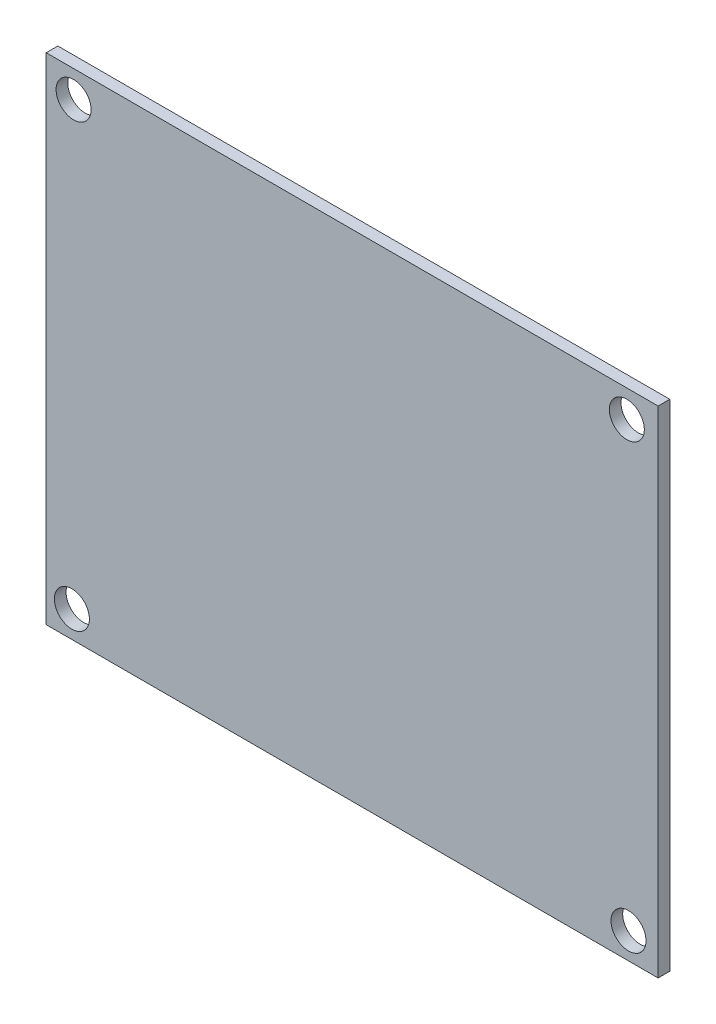
ISO-10303-21;
HEADER;
FILE_DESCRIPTION(('STEP AP214'),'2;1');
FILE_NAME('part.step','',(''),(''),'','','');
FILE_SCHEMA(('AUTOMOTIVE_DESIGN { 1 0 10303 214 1 1 1 1 }'));
ENDSEC;
DATA;
#1=APPLICATION_CONTEXT('core data for automotive mechanical design processes');
#2=APPLICATION_PROTOCOL_DEFINITION('international standard','automotive_design',2000,#1);
#3=PRODUCT_CONTEXT('',#1,'mechanical');
#4=PRODUCT('Part','Part','',(#3));
#5=PRODUCT_RELATED_PRODUCT_CATEGORY('part','',(#4));
#6=PRODUCT_DEFINITION_FORMATION('','',#4);
#7=PRODUCT_DEFINITION_CONTEXT('part definition',#1,'design');
#8=PRODUCT_DEFINITION('design','',#6,#7);
#9=PRODUCT_DEFINITION_SHAPE('','',#8);
#10=(LENGTH_UNIT() NAMED_UNIT(*) SI_UNIT(.MILLI.,.METRE.));
#11=(NAMED_UNIT(*) PLANE_ANGLE_UNIT() SI_UNIT($,.RADIAN.));
#12=(NAMED_UNIT(*) SI_UNIT($,.STERADIAN.) SOLID_ANGLE_UNIT());
#13=UNCERTAINTY_MEASURE_WITH_UNIT(LENGTH_MEASURE(1.E-05),#10,'distance_accuracy_value','');
#14=(GEOMETRIC_REPRESENTATION_CONTEXT(3) GLOBAL_UNCERTAINTY_ASSIGNED_CONTEXT((#13)) GLOBAL_UNIT_ASSIGNED_CONTEXT((#10,
#11,#12)) REPRESENTATION_CONTEXT('',''));
#15=CARTESIAN_POINT('',(0.,0.,0.));
#16=DIRECTION('',(0.,0.,1.));
#17=DIRECTION('',(1.,0.,0.));
#18=AXIS2_PLACEMENT_3D('',#15,#16,#17);
#19=CARTESIAN_POINT('',(0.,0.,2.));
#20=DIRECTION('',(0.,0.,1.));
#21=DIRECTION('',(1.,0.,0.));
#22=AXIS2_PLACEMENT_3D('',#19,#20,#21);
#23=PLANE('',#22);
#24=CARTESIAN_POINT('',(51.6959064904671,-46.9145005593792,2.));
#25=DIRECTION('',(0.,0.,1.));
#26=DIRECTION('',(1.,0.,0.));
#27=AXIS2_PLACEMENT_3D('',#24,#25,#26);
#28=CIRCLE('',#27,3.0033819293144);
#29=CARTESIAN_POINT('',(54.6992884197815,-46.9145005593792,2.));
#30=VERTEX_POINT('',#29);
#31=EDGE_CURVE('E125',#30,#30,#28,.T.);
#32=ORIENTED_EDGE('',*,*,#31,.F.);
#33=EDGE_LOOP('',(#32));
#34=FACE_BOUND('',#33,.T.);
#35=CARTESIAN_POINT('',(-43.525930299572,28.9850789753677,2.));
#36=DIRECTION('',(0.,0.,1.));
#37=DIRECTION('',(1.,0.,0.));
#38=AXIS2_PLACEMENT_3D('',#35,#36,#37);
#39=CIRCLE('',#38,3.0033819293144);
#40=CARTESIAN_POINT('',(-40.5225483702576,28.9850789753677,2.));
#41=VERTEX_POINT('',#40);
#42=EDGE_CURVE('E104',#41,#41,#39,.T.);
#43=ORIENTED_EDGE('',*,*,#42,.F.);
#44=EDGE_LOOP('',(#43));
#45=FACE_BOUND('',#44,.T.);
#46=DIRECTION('',(0.,-1.,0.));
#47=VECTOR('',#46,1.);
#48=CARTESIAN_POINT('',(-48.2234957020057,33.6103151862464,2.));
#49=LINE('',#48,#47);
#50=CARTESIAN_POINT('',(-48.2234957020057,33.6103151862464,2.));
#51=VERTEX_POINT('',#50);
#52=CARTESIAN_POINT('',(-48.2234957020057,-51.3896848137536,2.));
#53=VERTEX_POINT('',#52);
#54=EDGE_CURVE('E89',#51,#53,#49,.T.);
#55=ORIENTED_EDGE('',*,*,#54,.T.);
#56=DIRECTION('',(1.,0.,0.));
#57=VECTOR('',#56,1.);
#58=CARTESIAN_POINT('',(-48.2234957020057,-51.3896848137536,2.));
#59=LINE('',#58,#57);
#60=CARTESIAN_POINT('',(56.7765042979943,-51.3896848137536,2.));
#61=VERTEX_POINT('',#60);
#62=EDGE_CURVE('E84',#53,#61,#59,.T.);
#63=ORIENTED_EDGE('',*,*,#62,.T.);
#64=DIRECTION('',(0.,1.,0.));
#65=VECTOR('',#64,1.);
#66=CARTESIAN_POINT('',(56.7765042979943,33.6103151862464,2.));
#67=LINE('',#66,#65);
#68=CARTESIAN_POINT('',(56.7765042979943,33.6103151862464,2.));
#69=VERTEX_POINT('',#68);
#70=EDGE_CURVE('E87',#61,#69,#67,.T.);
#71=ORIENTED_EDGE('',*,*,#70,.T.);
#72=DIRECTION('',(-1.,0.,0.));
#73=VECTOR('',#72,1.);
#74=CARTESIAN_POINT('',(-48.2234957020057,33.6103151862464,2.));
#75=LINE('',#74,#73);
#76=EDGE_CURVE('E54',#69,#51,#75,.T.);
#77=ORIENTED_EDGE('',*,*,#76,.T.);
#78=EDGE_LOOP('',(#55,#63,#71,#77));
#79=FACE_BOUND('',#78,.T.);
#80=CARTESIAN_POINT('',(51.4072909805703,28.9296407296186,2.));
#81=DIRECTION('',(0.,0.,1.));
#82=DIRECTION('',(1.,0.,0.));
#83=AXIS2_PLACEMENT_3D('',#80,#81,#82);
#84=CIRCLE('',#83,3.0033819293144);
#85=CARTESIAN_POINT('',(54.4106729098847,28.9296407296186,2.));
#86=VERTEX_POINT('',#85);
#87=EDGE_CURVE('E119',#86,#86,#84,.T.);
#88=ORIENTED_EDGE('',*,*,#87,.F.);
#89=EDGE_LOOP('',(#88));
#90=FACE_BOUND('',#89,.T.);
#91=CARTESIAN_POINT('',(-43.8199031066054,-46.8494928662624,2.));
#92=DIRECTION('',(0.,0.,1.));
#93=DIRECTION('',(1.,0.,0.));
#94=AXIS2_PLACEMENT_3D('',#91,#92,#93);
#95=CIRCLE('',#94,3.0033819293144);
#96=CARTESIAN_POINT('',(-40.8165211772909,-46.8494928662624,2.));
#97=VERTEX_POINT('',#96);
#98=EDGE_CURVE('E131',#97,#97,#95,.T.);
#99=ORIENTED_EDGE('',*,*,#98,.F.);
#100=EDGE_LOOP('',(#99));
#101=FACE_BOUND('',#100,.T.);
#102=ADVANCED_FACE('F37',(#34,#45,#79,#90,#101),#23,.T.);
#103=CARTESIAN_POINT('',(0.,0.,0.));
#104=DIRECTION('',(0.,0.,1.));
#105=DIRECTION('',(1.,0.,0.));
#106=AXIS2_PLACEMENT_3D('',#103,#104,#105);
#107=PLANE('',#106);
#108=DIRECTION('',(0.,-1.,0.));
#109=VECTOR('',#108,1.);
#110=CARTESIAN_POINT('',(-48.2234957020057,33.6103151862464,0.));
#111=LINE('',#110,#109);
#112=CARTESIAN_POINT('',(-48.2234957020057,33.6103151862464,0.));
#113=VERTEX_POINT('',#112);
#114=CARTESIAN_POINT('',(-48.2234957020057,-51.3896848137536,0.));
#115=VERTEX_POINT('',#114);
#116=EDGE_CURVE('E101',#113,#115,#111,.T.);
#117=ORIENTED_EDGE('',*,*,#116,.F.);
#118=DIRECTION('',(-1.,0.,0.));
#119=VECTOR('',#118,1.);
#120=CARTESIAN_POINT('',(-48.2234957020057,33.6103151862464,0.));
#121=LINE('',#120,#119);
#122=CARTESIAN_POINT('',(56.7765042979943,33.6103151862464,0.));
#123=VERTEX_POINT('',#122);
#124=EDGE_CURVE('E77',#123,#113,#121,.T.);
#125=ORIENTED_EDGE('',*,*,#124,.F.);
#126=DIRECTION('',(0.,1.,0.));
#127=VECTOR('',#126,1.);
#128=CARTESIAN_POINT('',(56.7765042979943,33.6103151862464,0.));
#129=LINE('',#128,#127);
#130=CARTESIAN_POINT('',(56.7765042979943,-51.3896848137536,0.));
#131=VERTEX_POINT('',#130);
#132=EDGE_CURVE('E71',#131,#123,#129,.T.);
#133=ORIENTED_EDGE('',*,*,#132,.F.);
#134=DIRECTION('',(1.,0.,0.));
#135=VECTOR('',#134,1.);
#136=CARTESIAN_POINT('',(-48.2234957020057,-51.3896848137536,0.));
#137=LINE('',#136,#135);
#138=EDGE_CURVE('E93',#115,#131,#137,.T.);
#139=ORIENTED_EDGE('',*,*,#138,.F.);
#140=EDGE_LOOP('',(#117,#125,#133,#139));
#141=FACE_BOUND('',#140,.T.);
#142=CARTESIAN_POINT('',(-43.525930299572,28.9850789753677,0.));
#143=DIRECTION('',(0.,0.,1.));
#144=DIRECTION('',(1.,0.,0.));
#145=AXIS2_PLACEMENT_3D('',#142,#143,#144);
#146=CIRCLE('',#145,3.0033819293144);
#147=CARTESIAN_POINT('',(-40.5225483702576,28.9850789753677,0.));
#148=VERTEX_POINT('',#147);
#149=EDGE_CURVE('E116',#148,#148,#146,.T.);
#150=ORIENTED_EDGE('',*,*,#149,.T.);
#151=EDGE_LOOP('',(#150));
#152=FACE_BOUND('',#151,.T.);
#153=CARTESIAN_POINT('',(51.4072909805703,28.9296407296186,0.));
#154=DIRECTION('',(0.,0.,1.));
#155=DIRECTION('',(1.,0.,0.));
#156=AXIS2_PLACEMENT_3D('',#153,#154,#155);
#157=CIRCLE('',#156,3.0033819293144);
#158=CARTESIAN_POINT('',(54.4106729098847,28.9296407296186,0.));
#159=VERTEX_POINT('',#158);
#160=EDGE_CURVE('E122',#159,#159,#157,.T.);
#161=ORIENTED_EDGE('',*,*,#160,.T.);
#162=EDGE_LOOP('',(#161));
#163=FACE_BOUND('',#162,.T.);
#164=CARTESIAN_POINT('',(51.6959064904671,-46.9145005593792,0.));
#165=DIRECTION('',(0.,0.,1.));
#166=DIRECTION('',(1.,0.,0.));
#167=AXIS2_PLACEMENT_3D('',#164,#165,#166);
#168=CIRCLE('',#167,3.0033819293144);
#169=CARTESIAN_POINT('',(54.6992884197815,-46.9145005593792,0.));
#170=VERTEX_POINT('',#169);
#171=EDGE_CURVE('E128',#170,#170,#168,.T.);
#172=ORIENTED_EDGE('',*,*,#171,.T.);
#173=EDGE_LOOP('',(#172));
#174=FACE_BOUND('',#173,.T.);
#175=CARTESIAN_POINT('',(-43.8199031066054,-46.8494928662624,0.));
#176=DIRECTION('',(0.,0.,1.));
#177=DIRECTION('',(1.,0.,0.));
#178=AXIS2_PLACEMENT_3D('',#175,#176,#177);
#179=CIRCLE('',#178,3.0033819293144);
#180=CARTESIAN_POINT('',(-40.8165211772909,-46.8494928662624,0.));
#181=VERTEX_POINT('',#180);
#182=EDGE_CURVE('E134',#181,#181,#179,.T.);
#183=ORIENTED_EDGE('',*,*,#182,.T.);
#184=EDGE_LOOP('',(#183));
#185=FACE_BOUND('',#184,.T.);
#186=ADVANCED_FACE('F112',(#141,#152,#163,#174,#185),#107,.F.);
#187=CARTESIAN_POINT('',(-48.2234957020057,33.6103151862464,2.));
#188=DIRECTION('',(1.,0.,0.));
#189=DIRECTION('',(0.,0.,-1.));
#190=AXIS2_PLACEMENT_3D('',#187,#188,#189);
#191=PLANE('',#190);
#192=ORIENTED_EDGE('',*,*,#116,.T.);
#193=DIRECTION('',(0.,0.,-1.));
#194=VECTOR('',#193,1.);
#195=CARTESIAN_POINT('',(-48.2234957020057,-51.3896848137536,2.));
#196=LINE('',#195,#194);
#197=EDGE_CURVE('E11',#53,#115,#196,.T.);
#198=ORIENTED_EDGE('',*,*,#197,.F.);
#199=ORIENTED_EDGE('',*,*,#54,.F.);
#200=DIRECTION('',(0.,0.,-1.));
#201=VECTOR('',#200,1.);
#202=CARTESIAN_POINT('',(-48.2234957020057,33.6103151862464,2.));
#203=LINE('',#202,#201);
#204=EDGE_CURVE('E97',#51,#113,#203,.T.);
#205=ORIENTED_EDGE('',*,*,#204,.T.);
#206=EDGE_LOOP('',(#192,#198,#199,#205));
#207=FACE_BOUND('',#206,.T.);
#208=ADVANCED_FACE('F39',(#207),#191,.F.);
#209=CARTESIAN_POINT('',(-48.2234957020057,-51.3896848137536,2.));
#210=DIRECTION('',(0.,1.,0.));
#211=DIRECTION('',(-1.,0.,0.));
#212=AXIS2_PLACEMENT_3D('',#209,#210,#211);
#213=PLANE('',#212);
#214=ORIENTED_EDGE('',*,*,#138,.T.);
#215=DIRECTION('',(0.,0.,-1.));
#216=VECTOR('',#215,1.);
#217=CARTESIAN_POINT('',(56.7765042979943,-51.3896848137536,2.));
#218=LINE('',#217,#216);
#219=EDGE_CURVE('E46',#61,#131,#218,.T.);
#220=ORIENTED_EDGE('',*,*,#219,.F.);
#221=ORIENTED_EDGE('',*,*,#62,.F.);
#222=ORIENTED_EDGE('',*,*,#197,.T.);
#223=EDGE_LOOP('',(#214,#220,#221,#222));
#224=FACE_BOUND('',#223,.T.);
#225=ADVANCED_FACE('F92',(#224),#213,.F.);
#226=CARTESIAN_POINT('',(56.7765042979943,33.6103151862464,2.));
#227=DIRECTION('',(-1.,0.,0.));
#228=DIRECTION('',(0.,-1.,0.));
#229=AXIS2_PLACEMENT_3D('',#226,#227,#228);
#230=PLANE('',#229);
#231=ORIENTED_EDGE('',*,*,#132,.T.);
#232=DIRECTION('',(0.,0.,-1.));
#233=VECTOR('',#232,1.);
#234=CARTESIAN_POINT('',(56.7765042979943,33.6103151862464,2.));
#235=LINE('',#234,#233);
#236=EDGE_CURVE('E94',#69,#123,#235,.T.);
#237=ORIENTED_EDGE('',*,*,#236,.F.);
#238=ORIENTED_EDGE('',*,*,#70,.F.);
#239=ORIENTED_EDGE('',*,*,#219,.T.);
#240=EDGE_LOOP('',(#231,#237,#238,#239));
#241=FACE_BOUND('',#240,.T.);
#242=ADVANCED_FACE('F95',(#241),#230,.F.);
#243=CARTESIAN_POINT('',(-48.2234957020057,33.6103151862464,2.));
#244=DIRECTION('',(0.,-1.,0.));
#245=DIRECTION('',(0.,0.,-1.));
#246=AXIS2_PLACEMENT_3D('',#243,#244,#245);
#247=PLANE('',#246);
#248=ORIENTED_EDGE('',*,*,#124,.T.);
#249=ORIENTED_EDGE('',*,*,#204,.F.);
#250=ORIENTED_EDGE('',*,*,#76,.F.);
#251=ORIENTED_EDGE('',*,*,#236,.T.);
#252=EDGE_LOOP('',(#248,#249,#250,#251));
#253=FACE_BOUND('',#252,.T.);
#254=ADVANCED_FACE('F109',(#253),#247,.F.);
#255=CARTESIAN_POINT('',(-43.525930299572,28.9850789753677,2.));
#256=DIRECTION('',(0.,0.,-1.));
#257=DIRECTION('',(-1.,0.,0.));
#258=AXIS2_PLACEMENT_3D('',#255,#256,#257);
#259=CYLINDRICAL_SURFACE('',#258,3.0033819293144);
#260=ORIENTED_EDGE('',*,*,#42,.T.);
#261=EDGE_LOOP('',(#260));
#262=FACE_BOUND('',#261,.T.);
#263=ORIENTED_EDGE('',*,*,#149,.F.);
#264=EDGE_LOOP('',(#263));
#265=FACE_BOUND('',#264,.T.);
#266=ADVANCED_FACE('F153',(#262,#265),#259,.F.);
#267=CARTESIAN_POINT('',(51.4072909805703,28.9296407296186,2.));
#268=DIRECTION('',(0.,0.,-1.));
#269=DIRECTION('',(-1.,0.,0.));
#270=AXIS2_PLACEMENT_3D('',#267,#268,#269);
#271=CYLINDRICAL_SURFACE('',#270,3.0033819293144);
#272=ORIENTED_EDGE('',*,*,#87,.T.);
#273=EDGE_LOOP('',(#272));
#274=FACE_BOUND('',#273,.T.);
#275=ORIENTED_EDGE('',*,*,#160,.F.);
#276=EDGE_LOOP('',(#275));
#277=FACE_BOUND('',#276,.T.);
#278=ADVANCED_FACE('F207',(#274,#277),#271,.F.);
#279=CARTESIAN_POINT('',(51.6959064904671,-46.9145005593792,2.));
#280=DIRECTION('',(0.,0.,-1.));
#281=DIRECTION('',(-1.,0.,0.));
#282=AXIS2_PLACEMENT_3D('',#279,#280,#281);
#283=CYLINDRICAL_SURFACE('',#282,3.0033819293144);
#284=ORIENTED_EDGE('',*,*,#31,.T.);
#285=EDGE_LOOP('',(#284));
#286=FACE_BOUND('',#285,.T.);
#287=ORIENTED_EDGE('',*,*,#171,.F.);
#288=EDGE_LOOP('',(#287));
#289=FACE_BOUND('',#288,.T.);
#290=ADVANCED_FACE('F216',(#286,#289),#283,.F.);
#291=CARTESIAN_POINT('',(-43.8199031066054,-46.8494928662624,2.));
#292=DIRECTION('',(0.,0.,-1.));
#293=DIRECTION('',(-1.,0.,0.));
#294=AXIS2_PLACEMENT_3D('',#291,#292,#293);
#295=CYLINDRICAL_SURFACE('',#294,3.0033819293144);
#296=ORIENTED_EDGE('',*,*,#98,.T.);
#297=EDGE_LOOP('',(#296));
#298=FACE_BOUND('',#297,.T.);
#299=ORIENTED_EDGE('',*,*,#182,.F.);
#300=EDGE_LOOP('',(#299));
#301=FACE_BOUND('',#300,.T.);
#302=ADVANCED_FACE('F140',(#298,#301),#295,.F.);
#303=CLOSED_SHELL('',(#102,#186,#208,#225,#242,#254,#266,#278,#290,#302));
#304=MANIFOLD_SOLID_BREP('B2',#303);
#305=ADVANCED_BREP_SHAPE_REPRESENTATION('',(#18,#304),#14);
#306=SHAPE_DEFINITION_REPRESENTATION(#9,#305);
ENDSEC;
END-ISO-10303-21;
